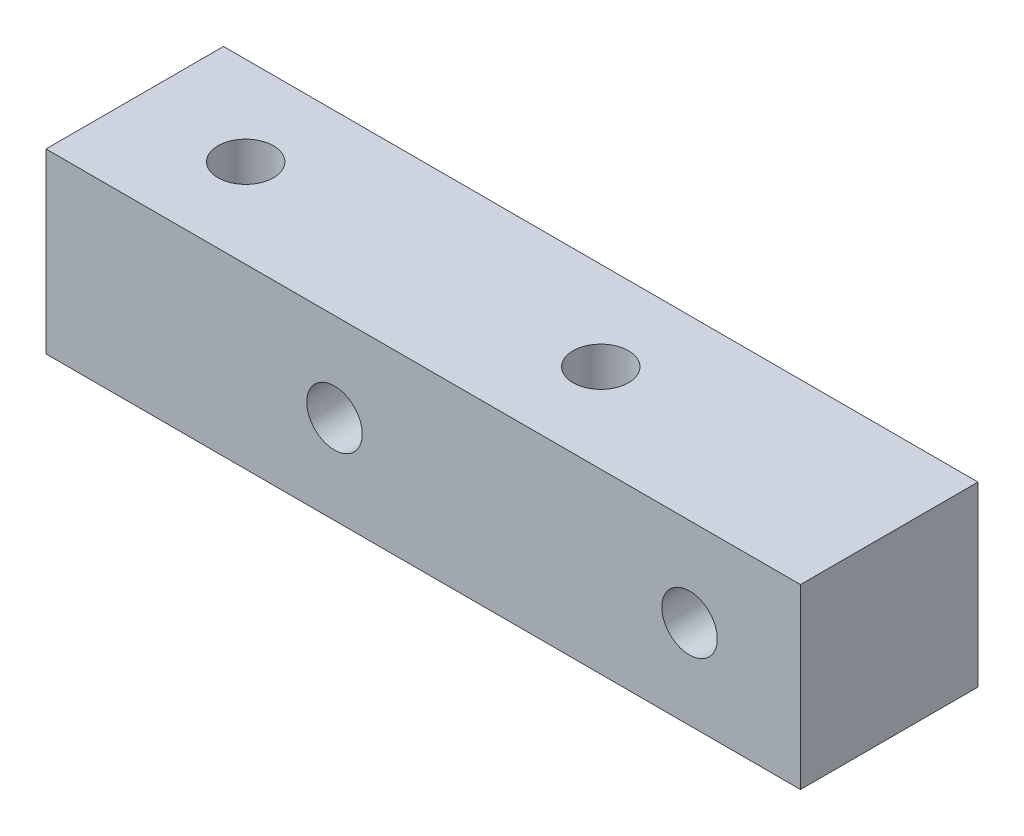
ISO-10303-21;
HEADER;
FILE_DESCRIPTION(('STEP AP214'),'2;1');
FILE_NAME('part.step','',(''),(''),'','','');
FILE_SCHEMA(('AUTOMOTIVE_DESIGN { 1 0 10303 214 1 1 1 1 }'));
ENDSEC;
DATA;
#1=APPLICATION_CONTEXT('core data for automotive mechanical design processes');
#2=APPLICATION_PROTOCOL_DEFINITION('international standard','automotive_design',2000,#1);
#3=PRODUCT_CONTEXT('',#1,'mechanical');
#4=PRODUCT('Part','Part','',(#3));
#5=PRODUCT_RELATED_PRODUCT_CATEGORY('part','',(#4));
#6=PRODUCT_DEFINITION_FORMATION('','',#4);
#7=PRODUCT_DEFINITION_CONTEXT('part definition',#1,'design');
#8=PRODUCT_DEFINITION('design','',#6,#7);
#9=PRODUCT_DEFINITION_SHAPE('','',#8);
#10=(LENGTH_UNIT() NAMED_UNIT(*) SI_UNIT(.MILLI.,.METRE.));
#11=(NAMED_UNIT(*) PLANE_ANGLE_UNIT() SI_UNIT($,.RADIAN.));
#12=(NAMED_UNIT(*) SI_UNIT($,.STERADIAN.) SOLID_ANGLE_UNIT());
#13=UNCERTAINTY_MEASURE_WITH_UNIT(LENGTH_MEASURE(1.E-05),#10,'distance_accuracy_value','');
#14=(GEOMETRIC_REPRESENTATION_CONTEXT(3) GLOBAL_UNCERTAINTY_ASSIGNED_CONTEXT((#13)) GLOBAL_UNIT_ASSIGNED_CONTEXT((#10,
#11,#12)) REPRESENTATION_CONTEXT('',''));
#15=CARTESIAN_POINT('',(0.,0.,0.));
#16=DIRECTION('',(0.,0.,1.));
#17=DIRECTION('',(1.,0.,0.));
#18=AXIS2_PLACEMENT_3D('',#15,#16,#17);
#19=CARTESIAN_POINT('',(-17.,-4.,8.));
#20=DIRECTION('',(1.,0.,0.));
#21=DIRECTION('',(0.,0.,-1.));
#22=AXIS2_PLACEMENT_3D('',#19,#20,#21);
#23=PLANE('',#22);
#24=DIRECTION('',(0.,-1.,0.));
#25=VECTOR('',#24,1.);
#26=CARTESIAN_POINT('',(-17.,-4.,0.));
#27=LINE('',#26,#25);
#28=CARTESIAN_POINT('',(-17.,4.,0.));
#29=VERTEX_POINT('',#28);
#30=CARTESIAN_POINT('',(-17.,-4.,0.));
#31=VERTEX_POINT('',#30);
#32=EDGE_CURVE('E99',#29,#31,#27,.T.);
#33=ORIENTED_EDGE('',*,*,#32,.T.);
#34=DIRECTION('',(0.,0.,-1.));
#35=VECTOR('',#34,1.);
#36=CARTESIAN_POINT('',(-17.,-4.,8.));
#37=LINE('',#36,#35);
#38=CARTESIAN_POINT('',(-17.,-4.,8.));
#39=VERTEX_POINT('',#38);
#40=EDGE_CURVE('E11',#39,#31,#37,.T.);
#41=ORIENTED_EDGE('',*,*,#40,.F.);
#42=DIRECTION('',(0.,-1.,0.));
#43=VECTOR('',#42,1.);
#44=CARTESIAN_POINT('',(-17.,-4.,8.));
#45=LINE('',#44,#43);
#46=CARTESIAN_POINT('',(-17.,4.,8.));
#47=VERTEX_POINT('',#46);
#48=EDGE_CURVE('E87',#47,#39,#45,.T.);
#49=ORIENTED_EDGE('',*,*,#48,.F.);
#50=DIRECTION('',(0.,0.,-1.));
#51=VECTOR('',#50,1.);
#52=CARTESIAN_POINT('',(-17.,4.,8.));
#53=LINE('',#52,#51);
#54=EDGE_CURVE('E95',#47,#29,#53,.T.);
#55=ORIENTED_EDGE('',*,*,#54,.T.);
#56=EDGE_LOOP('',(#33,#41,#49,#55));
#57=FACE_BOUND('',#56,.T.);
#58=ADVANCED_FACE('F36',(#57),#23,.F.);
#59=CARTESIAN_POINT('',(17.,-4.,8.));
#60=DIRECTION('',(0.,1.,0.));
#61=DIRECTION('',(-1.,0.,0.));
#62=AXIS2_PLACEMENT_3D('',#59,#60,#61);
#63=PLANE('',#62);
#64=CARTESIAN_POINT('',(4.00000000000001,-4.,4.));
#65=DIRECTION('',(0.,1.,0.));
#66=DIRECTION('',(0.,0.,1.));
#67=AXIS2_PLACEMENT_3D('',#64,#65,#66);
#68=CIRCLE('',#67,1.25);
#69=CARTESIAN_POINT('',(4.00000000000001,-4.,5.25));
#70=VERTEX_POINT('',#69);
#71=EDGE_CURVE('E130',#70,#70,#68,.T.);
#72=ORIENTED_EDGE('',*,*,#71,.T.);
#73=EDGE_LOOP('',(#72));
#74=FACE_BOUND('',#73,.T.);
#75=CARTESIAN_POINT('',(-12.,-4.,4.));
#76=DIRECTION('',(0.,1.,0.));
#77=DIRECTION('',(0.,0.,1.));
#78=AXIS2_PLACEMENT_3D('',#75,#76,#77);
#79=CIRCLE('',#78,1.25);
#80=CARTESIAN_POINT('',(-12.,-4.,5.25));
#81=VERTEX_POINT('',#80);
#82=EDGE_CURVE('E124',#81,#81,#79,.T.);
#83=ORIENTED_EDGE('',*,*,#82,.T.);
#84=EDGE_LOOP('',(#83));
#85=FACE_BOUND('',#84,.T.);
#86=DIRECTION('',(1.,0.,0.));
#87=VECTOR('',#86,1.);
#88=CARTESIAN_POINT('',(17.,-4.,0.));
#89=LINE('',#88,#87);
#90=CARTESIAN_POINT('',(17.,-4.,0.));
#91=VERTEX_POINT('',#90);
#92=EDGE_CURVE('E91',#31,#91,#89,.T.);
#93=ORIENTED_EDGE('',*,*,#92,.T.);
#94=DIRECTION('',(0.,0.,-1.));
#95=VECTOR('',#94,1.);
#96=CARTESIAN_POINT('',(17.,-4.,8.));
#97=LINE('',#96,#95);
#98=CARTESIAN_POINT('',(17.,-4.,8.));
#99=VERTEX_POINT('',#98);
#100=EDGE_CURVE('E44',#99,#91,#97,.T.);
#101=ORIENTED_EDGE('',*,*,#100,.F.);
#102=DIRECTION('',(1.,0.,0.));
#103=VECTOR('',#102,1.);
#104=CARTESIAN_POINT('',(17.,-4.,8.));
#105=LINE('',#104,#103);
#106=EDGE_CURVE('E82',#39,#99,#105,.T.);
#107=ORIENTED_EDGE('',*,*,#106,.F.);
#108=ORIENTED_EDGE('',*,*,#40,.T.);
#109=EDGE_LOOP('',(#93,#101,#107,#108));
#110=FACE_BOUND('',#109,.T.);
#111=ADVANCED_FACE('F90',(#74,#85,#110),#63,.F.);
#112=CARTESIAN_POINT('',(17.,-4.,8.));
#113=DIRECTION('',(-1.,0.,0.));
#114=DIRECTION('',(0.,0.,1.));
#115=AXIS2_PLACEMENT_3D('',#112,#113,#114);
#116=PLANE('',#115);
#117=DIRECTION('',(0.,1.,0.));
#118=VECTOR('',#117,1.);
#119=CARTESIAN_POINT('',(17.,-4.,0.));
#120=LINE('',#119,#118);
#121=CARTESIAN_POINT('',(17.,4.,0.));
#122=VERTEX_POINT('',#121);
#123=EDGE_CURVE('E69',#91,#122,#120,.T.);
#124=ORIENTED_EDGE('',*,*,#123,.T.);
#125=DIRECTION('',(0.,0.,-1.));
#126=VECTOR('',#125,1.);
#127=CARTESIAN_POINT('',(17.,4.,8.));
#128=LINE('',#127,#126);
#129=CARTESIAN_POINT('',(17.,4.,8.));
#130=VERTEX_POINT('',#129);
#131=EDGE_CURVE('E92',#130,#122,#128,.T.);
#132=ORIENTED_EDGE('',*,*,#131,.F.);
#133=DIRECTION('',(0.,1.,0.));
#134=VECTOR('',#133,1.);
#135=CARTESIAN_POINT('',(17.,-4.,8.));
#136=LINE('',#135,#134);
#137=EDGE_CURVE('E85',#99,#130,#136,.T.);
#138=ORIENTED_EDGE('',*,*,#137,.F.);
#139=ORIENTED_EDGE('',*,*,#100,.T.);
#140=EDGE_LOOP('',(#124,#132,#138,#139));
#141=FACE_BOUND('',#140,.T.);
#142=ADVANCED_FACE('F93',(#141),#116,.F.);
#143=CARTESIAN_POINT('',(17.,4.,8.));
#144=DIRECTION('',(0.,-1.,0.));
#145=DIRECTION('',(1.,0.,0.));
#146=AXIS2_PLACEMENT_3D('',#143,#144,#145);
#147=PLANE('',#146);
#148=CARTESIAN_POINT('',(4.00000000000001,4.,4.));
#149=DIRECTION('',(0.,1.,0.));
#150=DIRECTION('',(0.,0.,1.));
#151=AXIS2_PLACEMENT_3D('',#148,#149,#150);
#152=CIRCLE('',#151,1.25);
#153=CARTESIAN_POINT('',(4.00000000000001,4.,5.25));
#154=VERTEX_POINT('',#153);
#155=EDGE_CURVE('E133',#154,#154,#152,.T.);
#156=ORIENTED_EDGE('',*,*,#155,.F.);
#157=EDGE_LOOP('',(#156));
#158=FACE_BOUND('',#157,.T.);
#159=CARTESIAN_POINT('',(-12.,4.,4.));
#160=DIRECTION('',(0.,1.,0.));
#161=DIRECTION('',(0.,0.,1.));
#162=AXIS2_PLACEMENT_3D('',#159,#160,#161);
#163=CIRCLE('',#162,1.25);
#164=CARTESIAN_POINT('',(-12.,4.,5.25));
#165=VERTEX_POINT('',#164);
#166=EDGE_CURVE('E127',#165,#165,#163,.T.);
#167=ORIENTED_EDGE('',*,*,#166,.F.);
#168=EDGE_LOOP('',(#167));
#169=FACE_BOUND('',#168,.T.);
#170=DIRECTION('',(-1.,0.,0.));
#171=VECTOR('',#170,1.);
#172=CARTESIAN_POINT('',(17.,4.,0.));
#173=LINE('',#172,#171);
#174=EDGE_CURVE('E75',#122,#29,#173,.T.);
#175=ORIENTED_EDGE('',*,*,#174,.T.);
#176=ORIENTED_EDGE('',*,*,#54,.F.);
#177=DIRECTION('',(-1.,0.,0.));
#178=VECTOR('',#177,1.);
#179=CARTESIAN_POINT('',(17.,4.,8.));
#180=LINE('',#179,#178);
#181=EDGE_CURVE('E52',#130,#47,#180,.T.);
#182=ORIENTED_EDGE('',*,*,#181,.F.);
#183=ORIENTED_EDGE('',*,*,#131,.T.);
#184=EDGE_LOOP('',(#175,#176,#182,#183));
#185=FACE_BOUND('',#184,.T.);
#186=ADVANCED_FACE('F107',(#158,#169,#185),#147,.F.);
#187=CARTESIAN_POINT('',(0.,0.,8.));
#188=DIRECTION('',(0.,0.,1.));
#189=DIRECTION('',(1.,0.,0.));
#190=AXIS2_PLACEMENT_3D('',#187,#188,#189);
#191=PLANE('',#190);
#192=CARTESIAN_POINT('',(-3.99999999999999,0.,8.));
#193=DIRECTION('',(0.,0.,-1.));
#194=DIRECTION('',(-1.,0.,0.));
#195=AXIS2_PLACEMENT_3D('',#192,#193,#194);
#196=CIRCLE('',#195,1.25);
#197=CARTESIAN_POINT('',(-5.24999999999999,0.,8.));
#198=VERTEX_POINT('',#197);
#199=EDGE_CURVE('E118',#198,#198,#196,.T.);
#200=ORIENTED_EDGE('',*,*,#199,.T.);
#201=EDGE_LOOP('',(#200));
#202=FACE_BOUND('',#201,.T.);
#203=CARTESIAN_POINT('',(12.,0.,8.));
#204=DIRECTION('',(0.,0.,-1.));
#205=DIRECTION('',(-1.,0.,0.));
#206=AXIS2_PLACEMENT_3D('',#203,#204,#205);
#207=CIRCLE('',#206,1.25);
#208=CARTESIAN_POINT('',(10.75,0.,8.));
#209=VERTEX_POINT('',#208);
#210=EDGE_CURVE('E102',#209,#209,#207,.T.);
#211=ORIENTED_EDGE('',*,*,#210,.T.);
#212=EDGE_LOOP('',(#211));
#213=FACE_BOUND('',#212,.T.);
#214=ORIENTED_EDGE('',*,*,#48,.T.);
#215=ORIENTED_EDGE('',*,*,#106,.T.);
#216=ORIENTED_EDGE('',*,*,#137,.T.);
#217=ORIENTED_EDGE('',*,*,#181,.T.);
#218=EDGE_LOOP('',(#214,#215,#216,#217));
#219=FACE_BOUND('',#218,.T.);
#220=ADVANCED_FACE('F83',(#202,#213,#219),#191,.T.);
#221=CARTESIAN_POINT('',(0.,0.,0.));
#222=DIRECTION('',(0.,0.,1.));
#223=DIRECTION('',(1.,0.,0.));
#224=AXIS2_PLACEMENT_3D('',#221,#222,#223);
#225=PLANE('',#224);
#226=CARTESIAN_POINT('',(-3.99999999999999,0.,0.));
#227=DIRECTION('',(0.,0.,-1.));
#228=DIRECTION('',(-1.,0.,0.));
#229=AXIS2_PLACEMENT_3D('',#226,#227,#228);
#230=CIRCLE('',#229,1.25);
#231=CARTESIAN_POINT('',(-5.24999999999999,0.,0.));
#232=VERTEX_POINT('',#231);
#233=EDGE_CURVE('E121',#232,#232,#230,.T.);
#234=ORIENTED_EDGE('',*,*,#233,.F.);
#235=EDGE_LOOP('',(#234));
#236=FACE_BOUND('',#235,.T.);
#237=CARTESIAN_POINT('',(12.,0.,0.));
#238=DIRECTION('',(0.,0.,-1.));
#239=DIRECTION('',(-1.,0.,0.));
#240=AXIS2_PLACEMENT_3D('',#237,#238,#239);
#241=CIRCLE('',#240,1.25);
#242=CARTESIAN_POINT('',(10.75,0.,0.));
#243=VERTEX_POINT('',#242);
#244=EDGE_CURVE('E115',#243,#243,#241,.T.);
#245=ORIENTED_EDGE('',*,*,#244,.F.);
#246=EDGE_LOOP('',(#245));
#247=FACE_BOUND('',#246,.T.);
#248=ORIENTED_EDGE('',*,*,#32,.F.);
#249=ORIENTED_EDGE('',*,*,#174,.F.);
#250=ORIENTED_EDGE('',*,*,#123,.F.);
#251=ORIENTED_EDGE('',*,*,#92,.F.);
#252=EDGE_LOOP('',(#248,#249,#250,#251));
#253=FACE_BOUND('',#252,.T.);
#254=ADVANCED_FACE('F110',(#236,#247,#253),#225,.F.);
#255=CARTESIAN_POINT('',(12.,0.,0.));
#256=DIRECTION('',(0.,0.,-1.));
#257=DIRECTION('',(-1.,0.,0.));
#258=AXIS2_PLACEMENT_3D('',#255,#256,#257);
#259=CYLINDRICAL_SURFACE('',#258,1.25);
#260=ORIENTED_EDGE('',*,*,#210,.F.);
#261=EDGE_LOOP('',(#260));
#262=FACE_BOUND('',#261,.T.);
#263=ORIENTED_EDGE('',*,*,#244,.T.);
#264=EDGE_LOOP('',(#263));
#265=FACE_BOUND('',#264,.T.);
#266=ADVANCED_FACE('F155',(#262,#265),#259,.F.);
#267=CARTESIAN_POINT('',(-3.99999999999999,0.,0.));
#268=DIRECTION('',(0.,0.,-1.));
#269=DIRECTION('',(-1.,0.,0.));
#270=AXIS2_PLACEMENT_3D('',#267,#268,#269);
#271=CYLINDRICAL_SURFACE('',#270,1.25);
#272=ORIENTED_EDGE('',*,*,#199,.F.);
#273=EDGE_LOOP('',(#272));
#274=FACE_BOUND('',#273,.T.);
#275=ORIENTED_EDGE('',*,*,#233,.T.);
#276=EDGE_LOOP('',(#275));
#277=FACE_BOUND('',#276,.T.);
#278=ADVANCED_FACE('F146',(#274,#277),#271,.F.);
#279=CARTESIAN_POINT('',(-12.,4.,4.));
#280=DIRECTION('',(0.,1.,0.));
#281=DIRECTION('',(0.,0.,1.));
#282=AXIS2_PLACEMENT_3D('',#279,#280,#281);
#283=CYLINDRICAL_SURFACE('',#282,1.25);
#284=ORIENTED_EDGE('',*,*,#82,.F.);
#285=EDGE_LOOP('',(#284));
#286=FACE_BOUND('',#285,.T.);
#287=ORIENTED_EDGE('',*,*,#166,.T.);
#288=EDGE_LOOP('',(#287));
#289=FACE_BOUND('',#288,.T.);
#290=ADVANCED_FACE('F144',(#286,#289),#283,.F.);
#291=CARTESIAN_POINT('',(4.00000000000001,4.,4.));
#292=DIRECTION('',(0.,1.,0.));
#293=DIRECTION('',(0.,0.,1.));
#294=AXIS2_PLACEMENT_3D('',#291,#292,#293);
#295=CYLINDRICAL_SURFACE('',#294,1.25);
#296=ORIENTED_EDGE('',*,*,#71,.F.);
#297=EDGE_LOOP('',(#296));
#298=FACE_BOUND('',#297,.T.);
#299=ORIENTED_EDGE('',*,*,#155,.T.);
#300=EDGE_LOOP('',(#299));
#301=FACE_BOUND('',#300,.T.);
#302=ADVANCED_FACE('F137',(#298,#301),#295,.F.);
#303=CLOSED_SHELL('',(#58,#111,#142,#186,#220,#254,#266,#278,#290,#302));
#304=MANIFOLD_SOLID_BREP('B2',#303);
#305=ADVANCED_BREP_SHAPE_REPRESENTATION('',(#18,#304),#14);
#306=SHAPE_DEFINITION_REPRESENTATION(#9,#305);
ENDSEC;
END-ISO-10303-21;
